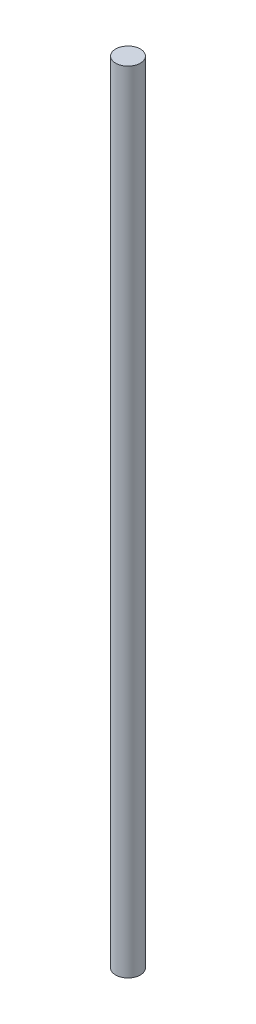
ISO-10303-21;
HEADER;
FILE_DESCRIPTION(('STEP AP214'),'2;1');
FILE_NAME('part.step','',(''),(''),'','','');
FILE_SCHEMA(('AUTOMOTIVE_DESIGN { 1 0 10303 214 1 1 1 1 }'));
ENDSEC;
DATA;
#1=APPLICATION_CONTEXT('core data for automotive mechanical design processes');
#2=APPLICATION_PROTOCOL_DEFINITION('international standard','automotive_design',2000,#1);
#3=PRODUCT_CONTEXT('',#1,'mechanical');
#4=PRODUCT('Part','Part','',(#3));
#5=PRODUCT_RELATED_PRODUCT_CATEGORY('part','',(#4));
#6=PRODUCT_DEFINITION_FORMATION('','',#4);
#7=PRODUCT_DEFINITION_CONTEXT('part definition',#1,'design');
#8=PRODUCT_DEFINITION('design','',#6,#7);
#9=PRODUCT_DEFINITION_SHAPE('','',#8);
#10=(LENGTH_UNIT() NAMED_UNIT(*) SI_UNIT(.MILLI.,.METRE.));
#11=(NAMED_UNIT(*) PLANE_ANGLE_UNIT() SI_UNIT($,.RADIAN.));
#12=(NAMED_UNIT(*) SI_UNIT($,.STERADIAN.) SOLID_ANGLE_UNIT());
#13=UNCERTAINTY_MEASURE_WITH_UNIT(LENGTH_MEASURE(1.E-05),#10,'distance_accuracy_value','');
#14=(GEOMETRIC_REPRESENTATION_CONTEXT(3) GLOBAL_UNCERTAINTY_ASSIGNED_CONTEXT((#13)) GLOBAL_UNIT_ASSIGNED_CONTEXT((#10,
#11,#12)) REPRESENTATION_CONTEXT('',''));
#15=CARTESIAN_POINT('',(0.,0.,0.));
#16=DIRECTION('',(0.,0.,1.));
#17=DIRECTION('',(1.,0.,0.));
#18=AXIS2_PLACEMENT_3D('',#15,#16,#17);
#19=CARTESIAN_POINT('',(0.,64.,0.));
#20=DIRECTION('',(0.,-1.,0.));
#21=DIRECTION('',(0.,0.,-1.));
#22=AXIS2_PLACEMENT_3D('',#19,#20,#21);
#23=CYLINDRICAL_SURFACE('',#22,1.);
#24=CARTESIAN_POINT('',(0.,64.,0.));
#25=DIRECTION('',(0.,1.,0.));
#26=DIRECTION('',(0.,0.,1.));
#27=AXIS2_PLACEMENT_3D('',#24,#25,#26);
#28=CIRCLE('',#27,1.);
#29=CARTESIAN_POINT('',(0.,64.,1.));
#30=VERTEX_POINT('',#29);
#31=EDGE_CURVE('E10',#30,#30,#28,.T.);
#32=ORIENTED_EDGE('',*,*,#31,.F.);
#33=EDGE_LOOP('',(#32));
#34=FACE_BOUND('',#33,.T.);
#35=CARTESIAN_POINT('',(0.,0.,0.));
#36=DIRECTION('',(0.,1.,0.));
#37=DIRECTION('',(0.,0.,1.));
#38=AXIS2_PLACEMENT_3D('',#35,#36,#37);
#39=CIRCLE('',#38,1.);
#40=CARTESIAN_POINT('',(0.,0.,1.));
#41=VERTEX_POINT('',#40);
#42=EDGE_CURVE('E42',#41,#41,#39,.T.);
#43=ORIENTED_EDGE('',*,*,#42,.T.);
#44=EDGE_LOOP('',(#43));
#45=FACE_BOUND('',#44,.T.);
#46=ADVANCED_FACE('F39',(#34,#45),#23,.T.);
#47=CARTESIAN_POINT('',(0.,64.,0.));
#48=DIRECTION('',(0.,1.,0.));
#49=DIRECTION('',(0.,0.,1.));
#50=AXIS2_PLACEMENT_3D('',#47,#48,#49);
#51=PLANE('',#50);
#52=ORIENTED_EDGE('',*,*,#31,.T.);
#53=EDGE_LOOP('',(#52));
#54=FACE_BOUND('',#53,.T.);
#55=ADVANCED_FACE('F54',(#54),#51,.T.);
#56=CARTESIAN_POINT('',(0.,0.,0.));
#57=DIRECTION('',(0.,1.,0.));
#58=DIRECTION('',(0.,0.,1.));
#59=AXIS2_PLACEMENT_3D('',#56,#57,#58);
#60=PLANE('',#59);
#61=ORIENTED_EDGE('',*,*,#42,.F.);
#62=EDGE_LOOP('',(#61));
#63=FACE_BOUND('',#62,.T.);
#64=ADVANCED_FACE('F52',(#63),#60,.F.);
#65=CLOSED_SHELL('',(#46,#55,#64));
#66=MANIFOLD_SOLID_BREP('B2',#65);
#67=ADVANCED_BREP_SHAPE_REPRESENTATION('',(#18,#66),#14);
#68=SHAPE_DEFINITION_REPRESENTATION(#9,#67);
ENDSEC;
END-ISO-10303-21;
